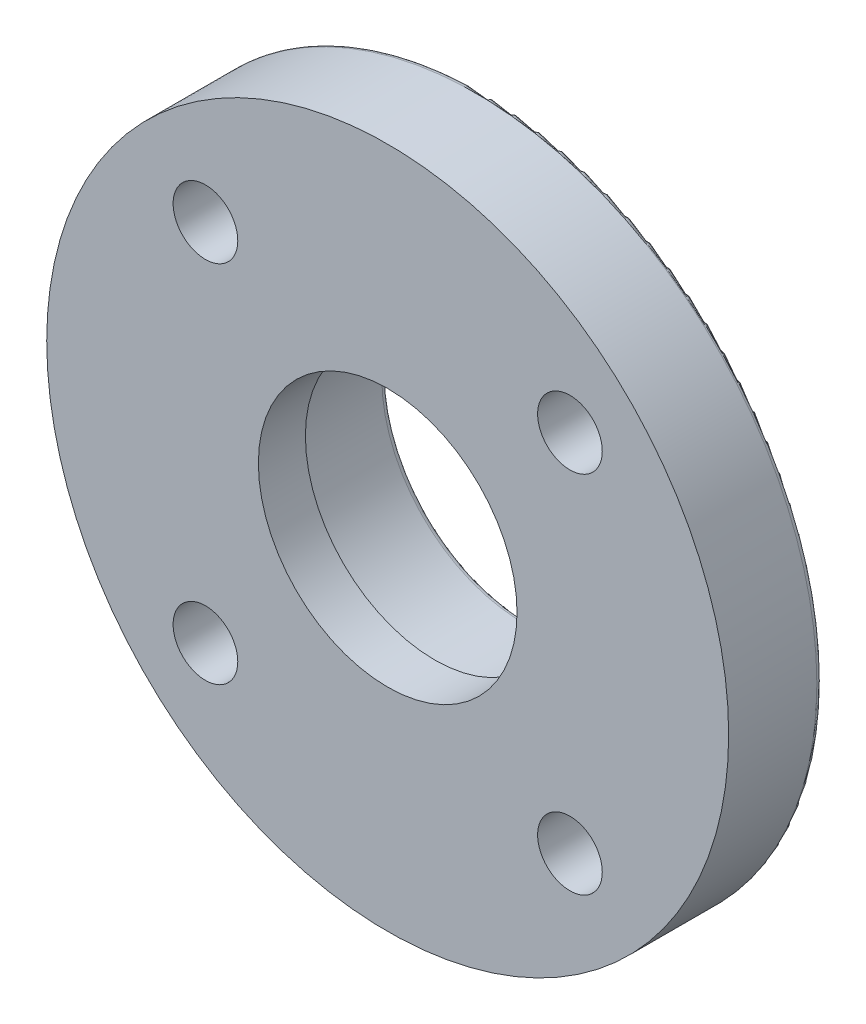
ISO-10303-21;
HEADER;
FILE_DESCRIPTION(('STEP AP214'),'2;1');
FILE_NAME('part.step','',(''),(''),'','','');
FILE_SCHEMA(('AUTOMOTIVE_DESIGN { 1 0 10303 214 1 1 1 1 }'));
ENDSEC;
DATA;
#1=APPLICATION_CONTEXT('core data for automotive mechanical design processes');
#2=APPLICATION_PROTOCOL_DEFINITION('international standard','automotive_design',2000,#1);
#3=PRODUCT_CONTEXT('',#1,'mechanical');
#4=PRODUCT('Part','Part','',(#3));
#5=PRODUCT_RELATED_PRODUCT_CATEGORY('part','',(#4));
#6=PRODUCT_DEFINITION_FORMATION('','',#4);
#7=PRODUCT_DEFINITION_CONTEXT('part definition',#1,'design');
#8=PRODUCT_DEFINITION('design','',#6,#7);
#9=PRODUCT_DEFINITION_SHAPE('','',#8);
#10=(LENGTH_UNIT() NAMED_UNIT(*) SI_UNIT(.MILLI.,.METRE.));
#11=(NAMED_UNIT(*) PLANE_ANGLE_UNIT() SI_UNIT($,.RADIAN.));
#12=(NAMED_UNIT(*) SI_UNIT($,.STERADIAN.) SOLID_ANGLE_UNIT());
#13=UNCERTAINTY_MEASURE_WITH_UNIT(LENGTH_MEASURE(1.E-05),#10,'distance_accuracy_value','');
#14=(GEOMETRIC_REPRESENTATION_CONTEXT(3) GLOBAL_UNCERTAINTY_ASSIGNED_CONTEXT((#13)) GLOBAL_UNIT_ASSIGNED_CONTEXT((#10,
#11,#12)) REPRESENTATION_CONTEXT('',''));
#15=CARTESIAN_POINT('',(0.,0.,0.));
#16=DIRECTION('',(0.,0.,1.));
#17=DIRECTION('',(1.,0.,0.));
#18=AXIS2_PLACEMENT_3D('',#15,#16,#17);
#19=CARTESIAN_POINT('',(0.,0.,-8.));
#20=DIRECTION('',(0.,0.,1.));
#21=DIRECTION('',(1.,0.,0.));
#22=AXIS2_PLACEMENT_3D('',#19,#20,#21);
#23=PLANE('',#22);
#24=CARTESIAN_POINT('',(0.,0.,-8.));
#25=DIRECTION('',(0.,0.,1.));
#26=DIRECTION('',(1.,0.,0.));
#27=AXIS2_PLACEMENT_3D('',#24,#25,#26);
#28=CIRCLE('',#27,28.5);
#29=CARTESIAN_POINT('',(28.5,0.,-8.));
#30=VERTEX_POINT('',#29);
#31=EDGE_CURVE('E55',#30,#30,#28,.F.);
#32=ORIENTED_EDGE('',*,*,#31,.T.);
#33=EDGE_LOOP('',(#32));
#34=FACE_BOUND('',#33,.T.);
#35=CARTESIAN_POINT('',(-15.5,15.5,-8.));
#36=DIRECTION('',(0.,0.,1.));
#37=DIRECTION('',(1.,0.,0.));
#38=AXIS2_PLACEMENT_3D('',#35,#36,#37);
#39=CIRCLE('',#38,2.75);
#40=CARTESIAN_POINT('',(-12.75,15.5,-8.));
#41=VERTEX_POINT('',#40);
#42=EDGE_CURVE('E67',#41,#41,#39,.T.);
#43=ORIENTED_EDGE('',*,*,#42,.T.);
#44=EDGE_LOOP('',(#43));
#45=FACE_BOUND('',#44,.T.);
#46=CARTESIAN_POINT('',(15.5,15.5,-8.));
#47=DIRECTION('',(0.,0.,1.));
#48=DIRECTION('',(1.,0.,0.));
#49=AXIS2_PLACEMENT_3D('',#46,#47,#48);
#50=CIRCLE('',#49,2.75);
#51=CARTESIAN_POINT('',(18.25,15.5,-8.));
#52=VERTEX_POINT('',#51);
#53=EDGE_CURVE('E71',#52,#52,#50,.T.);
#54=ORIENTED_EDGE('',*,*,#53,.T.);
#55=EDGE_LOOP('',(#54));
#56=FACE_BOUND('',#55,.T.);
#57=CARTESIAN_POINT('',(15.5,-15.5,-8.));
#58=DIRECTION('',(0.,0.,1.));
#59=DIRECTION('',(1.,0.,0.));
#60=AXIS2_PLACEMENT_3D('',#57,#58,#59);
#61=CIRCLE('',#60,2.75);
#62=CARTESIAN_POINT('',(18.25,-15.5,-8.));
#63=VERTEX_POINT('',#62);
#64=EDGE_CURVE('E77',#63,#63,#61,.T.);
#65=ORIENTED_EDGE('',*,*,#64,.T.);
#66=EDGE_LOOP('',(#65));
#67=FACE_BOUND('',#66,.T.);
#68=CARTESIAN_POINT('',(-15.5,-15.5,-8.));
#69=DIRECTION('',(0.,0.,1.));
#70=DIRECTION('',(1.,0.,0.));
#71=AXIS2_PLACEMENT_3D('',#68,#69,#70);
#72=CIRCLE('',#71,2.75);
#73=CARTESIAN_POINT('',(-12.75,-15.5,-8.));
#74=VERTEX_POINT('',#73);
#75=EDGE_CURVE('E83',#74,#74,#72,.T.);
#76=ORIENTED_EDGE('',*,*,#75,.T.);
#77=EDGE_LOOP('',(#76));
#78=FACE_BOUND('',#77,.T.);
#79=CARTESIAN_POINT('',(0.,0.,-8.));
#80=DIRECTION('',(0.,0.,1.));
#81=DIRECTION('',(1.,0.,0.));
#82=AXIS2_PLACEMENT_3D('',#79,#80,#81);
#83=CIRCLE('',#82,16.);
#84=CARTESIAN_POINT('',(16.,0.,-8.));
#85=VERTEX_POINT('',#84);
#86=EDGE_CURVE('E61',#85,#85,#83,.F.);
#87=ORIENTED_EDGE('',*,*,#86,.F.);
#88=EDGE_LOOP('',(#87));
#89=FACE_BOUND('',#88,.T.);
#90=ADVANCED_FACE('F35',(#34,#45,#56,#67,#78,#89),#23,.F.);
#91=CARTESIAN_POINT('',(0.,0.,-8.));
#92=DIRECTION('',(0.,0.,1.));
#93=DIRECTION('',(1.,0.,0.));
#94=AXIS2_PLACEMENT_3D('',#91,#92,#93);
#95=CYLINDRICAL_SURFACE('',#94,29.);
#96=CARTESIAN_POINT('',(0.,0.,-7.5));
#97=DIRECTION('',(0.,0.,1.));
#98=DIRECTION('',(1.,0.,0.));
#99=AXIS2_PLACEMENT_3D('',#96,#97,#98);
#100=CIRCLE('',#99,29.);
#101=CARTESIAN_POINT('',(29.,0.,-7.5));
#102=VERTEX_POINT('',#101);
#103=EDGE_CURVE('E58',#102,#102,#100,.T.);
#104=ORIENTED_EDGE('',*,*,#103,.T.);
#105=EDGE_LOOP('',(#104));
#106=FACE_BOUND('',#105,.T.);
#107=CARTESIAN_POINT('',(0.,0.,0.));
#108=DIRECTION('',(0.,0.,1.));
#109=DIRECTION('',(1.,0.,0.));
#110=AXIS2_PLACEMENT_3D('',#107,#108,#109);
#111=CIRCLE('',#110,29.);
#112=CARTESIAN_POINT('',(29.,0.,0.));
#113=VERTEX_POINT('',#112);
#114=EDGE_CURVE('E64',#113,#113,#111,.T.);
#115=ORIENTED_EDGE('',*,*,#114,.F.);
#116=EDGE_LOOP('',(#115));
#117=FACE_BOUND('',#116,.T.);
#118=ADVANCED_FACE('F133',(#106,#117),#95,.T.);
#119=CARTESIAN_POINT('',(0.,0.,0.));
#120=DIRECTION('',(0.,0.,1.));
#121=DIRECTION('',(1.,0.,0.));
#122=AXIS2_PLACEMENT_3D('',#119,#120,#121);
#123=PLANE('',#122);
#124=CARTESIAN_POINT('',(-15.5,-15.5,0.));
#125=DIRECTION('',(0.,0.,1.));
#126=DIRECTION('',(1.,0.,0.));
#127=AXIS2_PLACEMENT_3D('',#124,#125,#126);
#128=CIRCLE('',#127,2.75);
#129=CARTESIAN_POINT('',(-12.75,-15.5,0.));
#130=VERTEX_POINT('',#129);
#131=EDGE_CURVE('E86',#130,#130,#128,.T.);
#132=ORIENTED_EDGE('',*,*,#131,.F.);
#133=EDGE_LOOP('',(#132));
#134=FACE_BOUND('',#133,.T.);
#135=CARTESIAN_POINT('',(15.5,-15.5,0.));
#136=DIRECTION('',(0.,0.,1.));
#137=DIRECTION('',(1.,0.,0.));
#138=AXIS2_PLACEMENT_3D('',#135,#136,#137);
#139=CIRCLE('',#138,2.75);
#140=CARTESIAN_POINT('',(18.25,-15.5,0.));
#141=VERTEX_POINT('',#140);
#142=EDGE_CURVE('E80',#141,#141,#139,.T.);
#143=ORIENTED_EDGE('',*,*,#142,.F.);
#144=EDGE_LOOP('',(#143));
#145=FACE_BOUND('',#144,.T.);
#146=CARTESIAN_POINT('',(15.5,15.5,0.));
#147=DIRECTION('',(0.,0.,1.));
#148=DIRECTION('',(1.,0.,0.));
#149=AXIS2_PLACEMENT_3D('',#146,#147,#148);
#150=CIRCLE('',#149,2.75);
#151=CARTESIAN_POINT('',(18.25,15.5,0.));
#152=VERTEX_POINT('',#151);
#153=EDGE_CURVE('E74',#152,#152,#150,.T.);
#154=ORIENTED_EDGE('',*,*,#153,.F.);
#155=EDGE_LOOP('',(#154));
#156=FACE_BOUND('',#155,.T.);
#157=CARTESIAN_POINT('',(-15.5,15.5,0.));
#158=DIRECTION('',(0.,0.,1.));
#159=DIRECTION('',(1.,0.,0.));
#160=AXIS2_PLACEMENT_3D('',#157,#158,#159);
#161=CIRCLE('',#160,2.75);
#162=CARTESIAN_POINT('',(-12.75,15.5,0.));
#163=VERTEX_POINT('',#162);
#164=EDGE_CURVE('E68',#163,#163,#161,.T.);
#165=ORIENTED_EDGE('',*,*,#164,.F.);
#166=EDGE_LOOP('',(#165));
#167=FACE_BOUND('',#166,.T.);
#168=ORIENTED_EDGE('',*,*,#114,.T.);
#169=EDGE_LOOP('',(#168));
#170=FACE_BOUND('',#169,.T.);
#171=CARTESIAN_POINT('',(0.,0.,0.));
#172=DIRECTION('',(0.,0.,-1.));
#173=DIRECTION('',(-1.,0.,0.));
#174=AXIS2_PLACEMENT_3D('',#171,#172,#173);
#175=CIRCLE('',#174,11.);
#176=CARTESIAN_POINT('',(-11.,0.,0.));
#177=VERTEX_POINT('',#176);
#178=EDGE_CURVE('E94',#177,#177,#175,.T.);
#179=ORIENTED_EDGE('',*,*,#178,.T.);
#180=EDGE_LOOP('',(#179));
#181=FACE_BOUND('',#180,.T.);
#182=ADVANCED_FACE('F101',(#134,#145,#156,#167,#170,#181),#123,.T.);
#183=CARTESIAN_POINT('',(-15.5,15.5,-8.));
#184=DIRECTION('',(0.,0.,1.));
#185=DIRECTION('',(1.,0.,0.));
#186=AXIS2_PLACEMENT_3D('',#183,#184,#185);
#187=CYLINDRICAL_SURFACE('',#186,2.75);
#188=ORIENTED_EDGE('',*,*,#42,.F.);
#189=EDGE_LOOP('',(#188));
#190=FACE_BOUND('',#189,.T.);
#191=ORIENTED_EDGE('',*,*,#164,.T.);
#192=EDGE_LOOP('',(#191));
#193=FACE_BOUND('',#192,.T.);
#194=ADVANCED_FACE('F144',(#190,#193),#187,.F.);
#195=CARTESIAN_POINT('',(15.5,15.5,-8.));
#196=DIRECTION('',(0.,0.,1.));
#197=DIRECTION('',(1.,0.,0.));
#198=AXIS2_PLACEMENT_3D('',#195,#196,#197);
#199=CYLINDRICAL_SURFACE('',#198,2.75);
#200=ORIENTED_EDGE('',*,*,#53,.F.);
#201=EDGE_LOOP('',(#200));
#202=FACE_BOUND('',#201,.T.);
#203=ORIENTED_EDGE('',*,*,#153,.T.);
#204=EDGE_LOOP('',(#203));
#205=FACE_BOUND('',#204,.T.);
#206=ADVANCED_FACE('F238',(#202,#205),#199,.F.);
#207=CARTESIAN_POINT('',(15.5,-15.5,-8.));
#208=DIRECTION('',(0.,0.,1.));
#209=DIRECTION('',(1.,0.,0.));
#210=AXIS2_PLACEMENT_3D('',#207,#208,#209);
#211=CYLINDRICAL_SURFACE('',#210,2.75);
#212=ORIENTED_EDGE('',*,*,#64,.F.);
#213=EDGE_LOOP('',(#212));
#214=FACE_BOUND('',#213,.T.);
#215=ORIENTED_EDGE('',*,*,#142,.T.);
#216=EDGE_LOOP('',(#215));
#217=FACE_BOUND('',#216,.T.);
#218=ADVANCED_FACE('F128',(#214,#217),#211,.F.);
#219=CARTESIAN_POINT('',(-15.5,-15.5,-8.));
#220=DIRECTION('',(0.,0.,1.));
#221=DIRECTION('',(1.,0.,0.));
#222=AXIS2_PLACEMENT_3D('',#219,#220,#221);
#223=CYLINDRICAL_SURFACE('',#222,2.75);
#224=ORIENTED_EDGE('',*,*,#75,.F.);
#225=EDGE_LOOP('',(#224));
#226=FACE_BOUND('',#225,.T.);
#227=ORIENTED_EDGE('',*,*,#131,.T.);
#228=EDGE_LOOP('',(#227));
#229=FACE_BOUND('',#228,.T.);
#230=ADVANCED_FACE('F120',(#226,#229),#223,.F.);
#231=CARTESIAN_POINT('',(0.,0.,-8.));
#232=DIRECTION('',(0.,0.,1.));
#233=DIRECTION('',(1.,0.,0.));
#234=AXIS2_PLACEMENT_3D('',#231,#232,#233);
#235=CYLINDRICAL_SURFACE('',#234,12.);
#236=CARTESIAN_POINT('',(0.,0.,-11.5));
#237=DIRECTION('',(0.,0.,-1.));
#238=DIRECTION('',(-1.,0.,0.));
#239=AXIS2_PLACEMENT_3D('',#236,#237,#238);
#240=CIRCLE('',#239,12.);
#241=CARTESIAN_POINT('',(-12.,0.,-11.5));
#242=VERTEX_POINT('',#241);
#243=EDGE_CURVE('E50',#242,#242,#240,.T.);
#244=ORIENTED_EDGE('',*,*,#243,.T.);
#245=EDGE_LOOP('',(#244));
#246=FACE_BOUND('',#245,.T.);
#247=CARTESIAN_POINT('',(0.,0.,-4.));
#248=DIRECTION('',(0.,0.,-1.));
#249=DIRECTION('',(-1.,0.,0.));
#250=AXIS2_PLACEMENT_3D('',#247,#248,#249);
#251=CIRCLE('',#250,12.);
#252=CARTESIAN_POINT('',(-12.,0.,-4.));
#253=VERTEX_POINT('',#252);
#254=EDGE_CURVE('E89',#253,#253,#251,.T.);
#255=ORIENTED_EDGE('',*,*,#254,.F.);
#256=EDGE_LOOP('',(#255));
#257=FACE_BOUND('',#256,.T.);
#258=ADVANCED_FACE('F117',(#246,#257),#235,.F.);
#259=CARTESIAN_POINT('',(0.,0.,-12.));
#260=DIRECTION('',(0.,0.,-1.));
#261=DIRECTION('',(-1.,0.,0.));
#262=AXIS2_PLACEMENT_3D('',#259,#260,#261);
#263=PLANE('',#262);
#264=CARTESIAN_POINT('',(0.,0.,-12.));
#265=DIRECTION('',(0.,0.,-1.));
#266=DIRECTION('',(-1.,0.,0.));
#267=AXIS2_PLACEMENT_3D('',#264,#265,#266);
#268=CIRCLE('',#267,12.5);
#269=CARTESIAN_POINT('',(-12.5,0.,-12.));
#270=VERTEX_POINT('',#269);
#271=EDGE_CURVE('E42',#270,#270,#268,.F.);
#272=ORIENTED_EDGE('',*,*,#271,.T.);
#273=EDGE_LOOP('',(#272));
#274=FACE_BOUND('',#273,.T.);
#275=CARTESIAN_POINT('',(0.,0.,-12.));
#276=DIRECTION('',(0.,0.,-1.));
#277=DIRECTION('',(-1.,0.,0.));
#278=AXIS2_PLACEMENT_3D('',#275,#276,#277);
#279=CIRCLE('',#278,15.5);
#280=CARTESIAN_POINT('',(-15.5,0.,-12.));
#281=VERTEX_POINT('',#280);
#282=EDGE_CURVE('E46',#281,#281,#279,.T.);
#283=ORIENTED_EDGE('',*,*,#282,.T.);
#284=EDGE_LOOP('',(#283));
#285=FACE_BOUND('',#284,.T.);
#286=ADVANCED_FACE('F119',(#274,#285),#263,.T.);
#287=CARTESIAN_POINT('',(0.,0.,-12.));
#288=DIRECTION('',(0.,0.,1.));
#289=DIRECTION('',(1.,0.,0.));
#290=AXIS2_PLACEMENT_3D('',#287,#288,#289);
#291=CYLINDRICAL_SURFACE('',#290,16.);
#292=CARTESIAN_POINT('',(0.,0.,-11.5));
#293=DIRECTION('',(0.,0.,-1.));
#294=DIRECTION('',(-1.,0.,0.));
#295=AXIS2_PLACEMENT_3D('',#292,#293,#294);
#296=CIRCLE('',#295,16.);
#297=CARTESIAN_POINT('',(-16.,0.,-11.5));
#298=VERTEX_POINT('',#297);
#299=EDGE_CURVE('E10',#298,#298,#296,.F.);
#300=ORIENTED_EDGE('',*,*,#299,.T.);
#301=EDGE_LOOP('',(#300));
#302=FACE_BOUND('',#301,.T.);
#303=ORIENTED_EDGE('',*,*,#86,.T.);
#304=EDGE_LOOP('',(#303));
#305=FACE_BOUND('',#304,.T.);
#306=ADVANCED_FACE('F113',(#302,#305),#291,.T.);
#307=CARTESIAN_POINT('',(0.,0.,-4.));
#308=DIRECTION('',(0.,0.,-1.));
#309=DIRECTION('',(-1.,0.,0.));
#310=AXIS2_PLACEMENT_3D('',#307,#308,#309);
#311=PLANE('',#310);
#312=CARTESIAN_POINT('',(0.,0.,-4.));
#313=DIRECTION('',(0.,0.,-1.));
#314=DIRECTION('',(-1.,0.,0.));
#315=AXIS2_PLACEMENT_3D('',#312,#313,#314);
#316=CIRCLE('',#315,11.);
#317=CARTESIAN_POINT('',(-11.,0.,-4.));
#318=VERTEX_POINT('',#317);
#319=EDGE_CURVE('E95',#318,#318,#316,.T.);
#320=ORIENTED_EDGE('',*,*,#319,.F.);
#321=EDGE_LOOP('',(#320));
#322=FACE_BOUND('',#321,.T.);
#323=ORIENTED_EDGE('',*,*,#254,.T.);
#324=EDGE_LOOP('',(#323));
#325=FACE_BOUND('',#324,.T.);
#326=ADVANCED_FACE('F107',(#322,#325),#311,.T.);
#327=CARTESIAN_POINT('',(0.,0.,0.));
#328=DIRECTION('',(0.,0.,-1.));
#329=DIRECTION('',(-1.,0.,0.));
#330=AXIS2_PLACEMENT_3D('',#327,#328,#329);
#331=CYLINDRICAL_SURFACE('',#330,11.);
#332=ORIENTED_EDGE('',*,*,#178,.F.);
#333=EDGE_LOOP('',(#332));
#334=FACE_BOUND('',#333,.T.);
#335=ORIENTED_EDGE('',*,*,#319,.T.);
#336=EDGE_LOOP('',(#335));
#337=FACE_BOUND('',#336,.T.);
#338=ADVANCED_FACE('F103',(#334,#337),#331,.F.);
#339=CARTESIAN_POINT('',(0.,0.,-7.5));
#340=DIRECTION('',(0.,0.,1.));
#341=DIRECTION('',(1.,0.,0.));
#342=AXIS2_PLACEMENT_3D('',#339,#340,#341);
#343=TOROIDAL_SURFACE('',#342,28.5,0.5);
#344=ORIENTED_EDGE('',*,*,#31,.F.);
#345=EDGE_LOOP('',(#344));
#346=FACE_BOUND('',#345,.T.);
#347=ORIENTED_EDGE('',*,*,#103,.F.);
#348=EDGE_LOOP('',(#347));
#349=FACE_BOUND('',#348,.T.);
#350=ADVANCED_FACE('F106',(#346,#349),#343,.T.);
#351=CARTESIAN_POINT('',(0.,0.,-11.5));
#352=DIRECTION('',(0.,0.,-1.));
#353=DIRECTION('',(-1.,0.,0.));
#354=AXIS2_PLACEMENT_3D('',#351,#352,#353);
#355=TOROIDAL_SURFACE('',#354,12.5,0.5);
#356=ORIENTED_EDGE('',*,*,#271,.F.);
#357=EDGE_LOOP('',(#356));
#358=FACE_BOUND('',#357,.T.);
#359=ORIENTED_EDGE('',*,*,#243,.F.);
#360=EDGE_LOOP('',(#359));
#361=FACE_BOUND('',#360,.T.);
#362=ADVANCED_FACE('F150',(#358,#361),#355,.T.);
#363=CARTESIAN_POINT('',(0.,0.,-11.5));
#364=DIRECTION('',(0.,0.,-1.));
#365=DIRECTION('',(-1.,0.,0.));
#366=AXIS2_PLACEMENT_3D('',#363,#364,#365);
#367=TOROIDAL_SURFACE('',#366,15.5,0.5);
#368=ORIENTED_EDGE('',*,*,#299,.F.);
#369=EDGE_LOOP('',(#368));
#370=FACE_BOUND('',#369,.T.);
#371=ORIENTED_EDGE('',*,*,#282,.F.);
#372=EDGE_LOOP('',(#371));
#373=FACE_BOUND('',#372,.T.);
#374=ADVANCED_FACE('F37',(#370,#373),#367,.T.);
#375=CLOSED_SHELL('',(#90,#118,#182,#194,#206,#218,#230,#258,#286,#306,#326,#338,#350,#362,#374));
#376=MANIFOLD_SOLID_BREP('B2',#375);
#377=ADVANCED_BREP_SHAPE_REPRESENTATION('',(#18,#376),#14);
#378=SHAPE_DEFINITION_REPRESENTATION(#9,#377);
ENDSEC;
END-ISO-10303-21;
